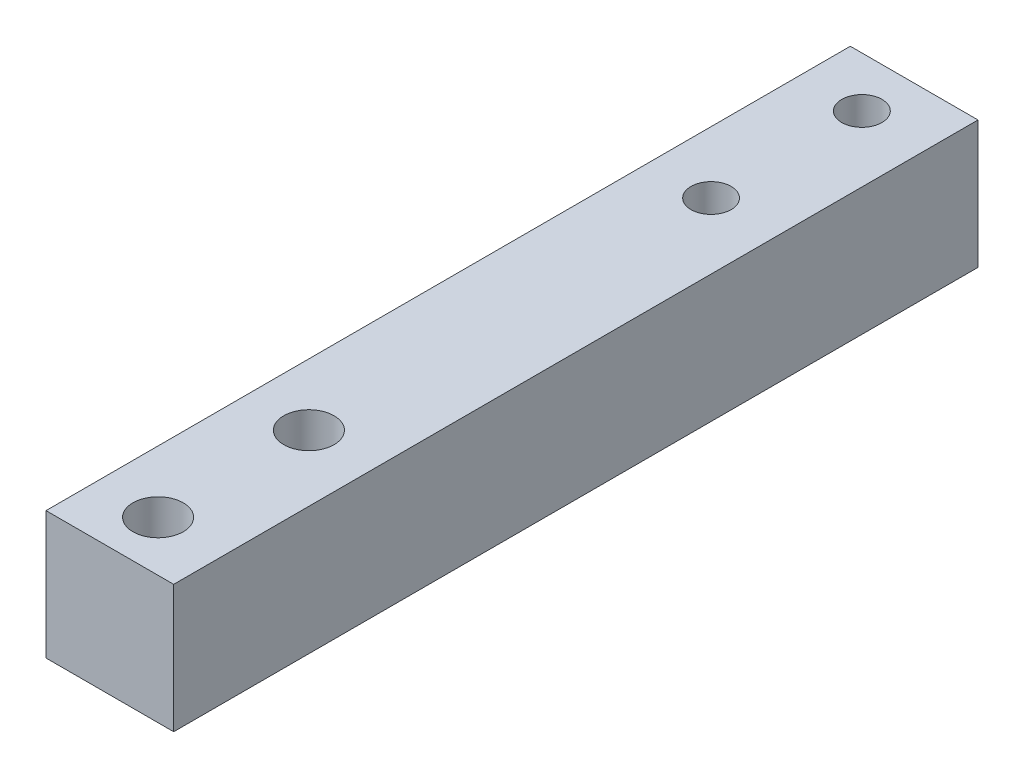
ISO-10303-21;
HEADER;
FILE_DESCRIPTION(('STEP AP214'),'2;1');
FILE_NAME('part.step','',(''),(''),'','','');
FILE_SCHEMA(('AUTOMOTIVE_DESIGN { 1 0 10303 214 1 1 1 1 }'));
ENDSEC;
DATA;
#1=APPLICATION_CONTEXT('core data for automotive mechanical design processes');
#2=APPLICATION_PROTOCOL_DEFINITION('international standard','automotive_design',2000,#1);
#3=PRODUCT_CONTEXT('',#1,'mechanical');
#4=PRODUCT('Part','Part','',(#3));
#5=PRODUCT_RELATED_PRODUCT_CATEGORY('part','',(#4));
#6=PRODUCT_DEFINITION_FORMATION('','',#4);
#7=PRODUCT_DEFINITION_CONTEXT('part definition',#1,'design');
#8=PRODUCT_DEFINITION('design','',#6,#7);
#9=PRODUCT_DEFINITION_SHAPE('','',#8);
#10=(LENGTH_UNIT() NAMED_UNIT(*) SI_UNIT(.MILLI.,.METRE.));
#11=(NAMED_UNIT(*) PLANE_ANGLE_UNIT() SI_UNIT($,.RADIAN.));
#12=(NAMED_UNIT(*) SI_UNIT($,.STERADIAN.) SOLID_ANGLE_UNIT());
#13=UNCERTAINTY_MEASURE_WITH_UNIT(LENGTH_MEASURE(1.E-05),#10,'distance_accuracy_value','');
#14=(GEOMETRIC_REPRESENTATION_CONTEXT(3) GLOBAL_UNCERTAINTY_ASSIGNED_CONTEXT((#13)) GLOBAL_UNIT_ASSIGNED_CONTEXT((#10,
#11,#12)) REPRESENTATION_CONTEXT('',''));
#15=CARTESIAN_POINT('',(0.,0.,0.));
#16=DIRECTION('',(0.,0.,1.));
#17=DIRECTION('',(1.,0.,0.));
#18=AXIS2_PLACEMENT_3D('',#15,#16,#17);
#19=CARTESIAN_POINT('',(-262.44218195293,-44.9739937166285,-48.1574778179379));
#20=DIRECTION('',(0.,0.,1.));
#21=DIRECTION('',(0.,-1.,0.));
#22=AXIS2_PLACEMENT_3D('',#19,#20,#21);
#23=PLANE('',#22);
#24=DIRECTION('',(1.,0.,0.));
#25=VECTOR('',#24,1.);
#26=CARTESIAN_POINT('',(-262.44218195293,-32.2739937166286,-48.1574778179379));
#27=LINE('',#26,#25);
#28=CARTESIAN_POINT('',(-275.14218195293,-32.2739937166286,-48.1574778179379));
#29=VERTEX_POINT('',#28);
#30=CARTESIAN_POINT('',(-262.44218195293,-32.2739937166286,-48.1574778179379));
#31=VERTEX_POINT('',#30);
#32=EDGE_CURVE('E119',#29,#31,#27,.T.);
#33=ORIENTED_EDGE('',*,*,#32,.F.);
#34=DIRECTION('',(0.,1.,0.));
#35=VECTOR('',#34,1.);
#36=CARTESIAN_POINT('',(-275.14218195293,-44.9739937166285,-48.1574778179379));
#37=LINE('',#36,#35);
#38=CARTESIAN_POINT('',(-275.14218195293,-44.9739937166285,-48.1574778179379));
#39=VERTEX_POINT('',#38);
#40=EDGE_CURVE('E11',#39,#29,#37,.T.);
#41=ORIENTED_EDGE('',*,*,#40,.F.);
#42=DIRECTION('',(1.,0.,0.));
#43=VECTOR('',#42,1.);
#44=CARTESIAN_POINT('',(-262.44218195293,-44.9739937166285,-48.1574778179379));
#45=LINE('',#44,#43);
#46=CARTESIAN_POINT('',(-262.44218195293,-44.9739937166285,-48.1574778179379));
#47=VERTEX_POINT('',#46);
#48=EDGE_CURVE('E109',#39,#47,#45,.T.);
#49=ORIENTED_EDGE('',*,*,#48,.T.);
#50=DIRECTION('',(0.,1.,0.));
#51=VECTOR('',#50,1.);
#52=CARTESIAN_POINT('',(-262.44218195293,-44.9739937166285,-48.1574778179379));
#53=LINE('',#52,#51);
#54=EDGE_CURVE('E44',#47,#31,#53,.T.);
#55=ORIENTED_EDGE('',*,*,#54,.T.);
#56=EDGE_LOOP('',(#33,#41,#49,#55));
#57=FACE_BOUND('',#56,.T.);
#58=ADVANCED_FACE('F41',(#57),#23,.T.);
#59=CARTESIAN_POINT('',(-275.14218195293,-44.9739937166285,-48.1574778179379));
#60=DIRECTION('',(-1.,0.,0.));
#61=DIRECTION('',(0.,-1.,0.));
#62=AXIS2_PLACEMENT_3D('',#59,#60,#61);
#63=PLANE('',#62);
#64=DIRECTION('',(0.,0.,1.));
#65=VECTOR('',#64,1.);
#66=CARTESIAN_POINT('',(-275.14218195293,-32.2739937166286,-48.1574778179379));
#67=LINE('',#66,#65);
#68=CARTESIAN_POINT('',(-275.14218195293,-32.2739937166286,-128.157477817938));
#69=VERTEX_POINT('',#68);
#70=EDGE_CURVE('E113',#69,#29,#67,.T.);
#71=ORIENTED_EDGE('',*,*,#70,.F.);
#72=DIRECTION('',(0.,1.,0.));
#73=VECTOR('',#72,1.);
#74=CARTESIAN_POINT('',(-275.14218195293,-44.9739937166286,-128.157477817938));
#75=LINE('',#74,#73);
#76=CARTESIAN_POINT('',(-275.14218195293,-44.9739937166286,-128.157477817938));
#77=VERTEX_POINT('',#76);
#78=EDGE_CURVE('E51',#77,#69,#75,.T.);
#79=ORIENTED_EDGE('',*,*,#78,.F.);
#80=DIRECTION('',(0.,0.,1.));
#81=VECTOR('',#80,1.);
#82=CARTESIAN_POINT('',(-275.14218195293,-44.9739937166285,-48.1574778179379));
#83=LINE('',#82,#81);
#84=EDGE_CURVE('E104',#77,#39,#83,.T.);
#85=ORIENTED_EDGE('',*,*,#84,.T.);
#86=ORIENTED_EDGE('',*,*,#40,.T.);
#87=EDGE_LOOP('',(#71,#79,#85,#86));
#88=FACE_BOUND('',#87,.T.);
#89=ADVANCED_FACE('F195',(#88),#63,.T.);
#90=CARTESIAN_POINT('',(-262.44218195293,-44.9739937166286,-128.157477817938));
#91=DIRECTION('',(0.,0.,-1.));
#92=DIRECTION('',(0.,1.,0.));
#93=AXIS2_PLACEMENT_3D('',#90,#91,#92);
#94=PLANE('',#93);
#95=DIRECTION('',(-1.,0.,0.));
#96=VECTOR('',#95,1.);
#97=CARTESIAN_POINT('',(-262.44218195293,-32.2739937166286,-128.157477817938));
#98=LINE('',#97,#96);
#99=CARTESIAN_POINT('',(-262.44218195293,-32.2739937166286,-128.157477817938));
#100=VERTEX_POINT('',#99);
#101=EDGE_CURVE('E98',#100,#69,#98,.T.);
#102=ORIENTED_EDGE('',*,*,#101,.F.);
#103=DIRECTION('',(0.,1.,0.));
#104=VECTOR('',#103,1.);
#105=CARTESIAN_POINT('',(-262.44218195293,-44.9739937166286,-128.157477817938));
#106=LINE('',#105,#104);
#107=CARTESIAN_POINT('',(-262.44218195293,-44.9739937166286,-128.157477817938));
#108=VERTEX_POINT('',#107);
#109=EDGE_CURVE('E93',#108,#100,#106,.T.);
#110=ORIENTED_EDGE('',*,*,#109,.F.);
#111=DIRECTION('',(-1.,0.,0.));
#112=VECTOR('',#111,1.);
#113=CARTESIAN_POINT('',(-262.44218195293,-44.9739937166286,-128.157477817938));
#114=LINE('',#113,#112);
#115=EDGE_CURVE('E96',#108,#77,#114,.T.);
#116=ORIENTED_EDGE('',*,*,#115,.T.);
#117=ORIENTED_EDGE('',*,*,#78,.T.);
#118=EDGE_LOOP('',(#102,#110,#116,#117));
#119=FACE_BOUND('',#118,.T.);
#120=ADVANCED_FACE('F95',(#119),#94,.T.);
#121=CARTESIAN_POINT('',(-262.44218195293,-44.9739937166285,-48.1574778179379));
#122=DIRECTION('',(1.,0.,0.));
#123=DIRECTION('',(0.,1.,0.));
#124=AXIS2_PLACEMENT_3D('',#121,#122,#123);
#125=PLANE('',#124);
#126=DIRECTION('',(0.,0.,-1.));
#127=VECTOR('',#126,1.);
#128=CARTESIAN_POINT('',(-262.44218195293,-32.2739937166286,-48.1574778179379));
#129=LINE('',#128,#127);
#130=EDGE_CURVE('E123',#31,#100,#129,.T.);
#131=ORIENTED_EDGE('',*,*,#130,.F.);
#132=ORIENTED_EDGE('',*,*,#54,.F.);
#133=DIRECTION('',(0.,0.,-1.));
#134=VECTOR('',#133,1.);
#135=CARTESIAN_POINT('',(-262.44218195293,-44.9739937166285,-48.1574778179379));
#136=LINE('',#135,#134);
#137=EDGE_CURVE('E103',#47,#108,#136,.T.);
#138=ORIENTED_EDGE('',*,*,#137,.T.);
#139=ORIENTED_EDGE('',*,*,#109,.T.);
#140=EDGE_LOOP('',(#131,#132,#138,#139));
#141=FACE_BOUND('',#140,.T.);
#142=ADVANCED_FACE('F107',(#141),#125,.T.);
#143=CARTESIAN_POINT('',(0.,-44.9739937166285,0.));
#144=DIRECTION('',(0.,-1.,0.));
#145=DIRECTION('',(0.,0.,-1.));
#146=AXIS2_PLACEMENT_3D('',#143,#144,#145);
#147=PLANE('',#146);
#148=CARTESIAN_POINT('',(-268.992578515679,-44.9739937166284,-68.1574778179379));
#149=DIRECTION('',(0.,-1.,0.));
#150=DIRECTION('',(1.,0.,0.));
#151=AXIS2_PLACEMENT_3D('',#148,#149,#150);
#152=CIRCLE('',#151,2.50000000000002);
#153=CARTESIAN_POINT('',(-266.492578515679,-44.9739937166284,-68.1574778179379));
#154=VERTEX_POINT('',#153);
#155=EDGE_CURVE('E156',#154,#154,#152,.T.);
#156=ORIENTED_EDGE('',*,*,#155,.F.);
#157=EDGE_LOOP('',(#156));
#158=FACE_BOUND('',#157,.T.);
#159=CARTESIAN_POINT('',(-268.992578515679,-44.9739937166284,-53.1574778179379));
#160=DIRECTION('',(0.,-1.,0.));
#161=DIRECTION('',(1.,0.,0.));
#162=AXIS2_PLACEMENT_3D('',#159,#160,#161);
#163=CIRCLE('',#162,2.50000000000002);
#164=CARTESIAN_POINT('',(-266.492578515679,-44.9739937166284,-53.1574778179379));
#165=VERTEX_POINT('',#164);
#166=EDGE_CURVE('E149',#165,#165,#163,.T.);
#167=ORIENTED_EDGE('',*,*,#166,.F.);
#168=EDGE_LOOP('',(#167));
#169=FACE_BOUND('',#168,.T.);
#170=CARTESIAN_POINT('',(-268.992578515679,-44.9739937166284,-108.157477817938));
#171=DIRECTION('',(0.,-1.,0.));
#172=DIRECTION('',(1.,0.,0.));
#173=AXIS2_PLACEMENT_3D('',#170,#171,#172);
#174=CIRCLE('',#173,2.);
#175=CARTESIAN_POINT('',(-266.992578515679,-44.9739937166284,-108.157477817938));
#176=VERTEX_POINT('',#175);
#177=EDGE_CURVE('E143',#176,#176,#174,.T.);
#178=ORIENTED_EDGE('',*,*,#177,.F.);
#179=EDGE_LOOP('',(#178));
#180=FACE_BOUND('',#179,.T.);
#181=CARTESIAN_POINT('',(-268.992578515679,-44.9739937166284,-123.157477817938));
#182=DIRECTION('',(0.,-1.,0.));
#183=DIRECTION('',(1.,0.,0.));
#184=AXIS2_PLACEMENT_3D('',#181,#182,#183);
#185=CIRCLE('',#184,2.);
#186=CARTESIAN_POINT('',(-266.992578515679,-44.9739937166284,-123.157477817938));
#187=VERTEX_POINT('',#186);
#188=EDGE_CURVE('E133',#187,#187,#185,.T.);
#189=ORIENTED_EDGE('',*,*,#188,.F.);
#190=EDGE_LOOP('',(#189));
#191=FACE_BOUND('',#190,.T.);
#192=ORIENTED_EDGE('',*,*,#48,.F.);
#193=ORIENTED_EDGE('',*,*,#84,.F.);
#194=ORIENTED_EDGE('',*,*,#115,.F.);
#195=ORIENTED_EDGE('',*,*,#137,.F.);
#196=EDGE_LOOP('',(#192,#193,#194,#195));
#197=FACE_BOUND('',#196,.T.);
#198=ADVANCED_FACE('F102',(#158,#169,#180,#191,#197),#147,.T.);
#199=CARTESIAN_POINT('',(0.,-32.2739937166285,0.));
#200=DIRECTION('',(0.,-1.,0.));
#201=DIRECTION('',(0.,0.,-1.));
#202=AXIS2_PLACEMENT_3D('',#199,#200,#201);
#203=PLANE('',#202);
#204=CARTESIAN_POINT('',(-268.992578515679,-32.2739937166284,-68.1574778179379));
#205=DIRECTION('',(0.,-1.,0.));
#206=DIRECTION('',(1.,0.,0.));
#207=AXIS2_PLACEMENT_3D('',#204,#205,#206);
#208=CIRCLE('',#207,2.50000000000002);
#209=CARTESIAN_POINT('',(-266.492578515679,-32.2739937166284,-68.1574778179379));
#210=VERTEX_POINT('',#209);
#211=EDGE_CURVE('E153',#210,#210,#208,.T.);
#212=ORIENTED_EDGE('',*,*,#211,.T.);
#213=EDGE_LOOP('',(#212));
#214=FACE_BOUND('',#213,.T.);
#215=CARTESIAN_POINT('',(-268.992578515679,-32.2739937166284,-53.1574778179379));
#216=DIRECTION('',(0.,-1.,0.));
#217=DIRECTION('',(1.,0.,0.));
#218=AXIS2_PLACEMENT_3D('',#215,#216,#217);
#219=CIRCLE('',#218,2.50000000000002);
#220=CARTESIAN_POINT('',(-266.492578515679,-32.2739937166284,-53.1574778179379));
#221=VERTEX_POINT('',#220);
#222=EDGE_CURVE('E147',#221,#221,#219,.T.);
#223=ORIENTED_EDGE('',*,*,#222,.T.);
#224=EDGE_LOOP('',(#223));
#225=FACE_BOUND('',#224,.T.);
#226=CARTESIAN_POINT('',(-268.992578515679,-32.2739937166284,-108.157477817938));
#227=DIRECTION('',(0.,-1.,0.));
#228=DIRECTION('',(1.,0.,0.));
#229=AXIS2_PLACEMENT_3D('',#226,#227,#228);
#230=CIRCLE('',#229,2.);
#231=CARTESIAN_POINT('',(-266.992578515679,-32.2739937166284,-108.157477817938));
#232=VERTEX_POINT('',#231);
#233=EDGE_CURVE('E135',#232,#232,#230,.T.);
#234=ORIENTED_EDGE('',*,*,#233,.T.);
#235=EDGE_LOOP('',(#234));
#236=FACE_BOUND('',#235,.T.);
#237=CARTESIAN_POINT('',(-268.992578515679,-32.2739937166284,-123.157477817938));
#238=DIRECTION('',(0.,-1.,0.));
#239=DIRECTION('',(1.,0.,0.));
#240=AXIS2_PLACEMENT_3D('',#237,#238,#239);
#241=CIRCLE('',#240,2.);
#242=CARTESIAN_POINT('',(-266.992578515679,-32.2739937166284,-123.157477817938));
#243=VERTEX_POINT('',#242);
#244=EDGE_CURVE('E124',#243,#243,#241,.T.);
#245=ORIENTED_EDGE('',*,*,#244,.T.);
#246=EDGE_LOOP('',(#245));
#247=FACE_BOUND('',#246,.T.);
#248=ORIENTED_EDGE('',*,*,#32,.T.);
#249=ORIENTED_EDGE('',*,*,#130,.T.);
#250=ORIENTED_EDGE('',*,*,#101,.T.);
#251=ORIENTED_EDGE('',*,*,#70,.T.);
#252=EDGE_LOOP('',(#248,#249,#250,#251));
#253=FACE_BOUND('',#252,.T.);
#254=ADVANCED_FACE('F162',(#214,#225,#236,#247,#253),#203,.F.);
#255=CARTESIAN_POINT('',(-268.992578515679,-32.2739937166284,-123.157477817938));
#256=DIRECTION('',(0.,-1.,0.));
#257=DIRECTION('',(1.,0.,0.));
#258=AXIS2_PLACEMENT_3D('',#255,#256,#257);
#259=CYLINDRICAL_SURFACE('',#258,2.);
#260=ORIENTED_EDGE('',*,*,#244,.F.);
#261=EDGE_LOOP('',(#260));
#262=FACE_BOUND('',#261,.T.);
#263=ORIENTED_EDGE('',*,*,#188,.T.);
#264=EDGE_LOOP('',(#263));
#265=FACE_BOUND('',#264,.T.);
#266=ADVANCED_FACE('F182',(#262,#265),#259,.F.);
#267=CARTESIAN_POINT('',(-268.992578515679,-32.2739937166284,-108.157477817938));
#268=DIRECTION('',(0.,-1.,0.));
#269=DIRECTION('',(1.,0.,0.));
#270=AXIS2_PLACEMENT_3D('',#267,#268,#269);
#271=CYLINDRICAL_SURFACE('',#270,2.);
#272=ORIENTED_EDGE('',*,*,#233,.F.);
#273=EDGE_LOOP('',(#272));
#274=FACE_BOUND('',#273,.T.);
#275=ORIENTED_EDGE('',*,*,#177,.T.);
#276=EDGE_LOOP('',(#275));
#277=FACE_BOUND('',#276,.T.);
#278=ADVANCED_FACE('F180',(#274,#277),#271,.F.);
#279=CARTESIAN_POINT('',(-268.992578515679,-32.2739937166284,-53.1574778179379));
#280=DIRECTION('',(0.,-1.,0.));
#281=DIRECTION('',(1.,0.,0.));
#282=AXIS2_PLACEMENT_3D('',#279,#280,#281);
#283=CYLINDRICAL_SURFACE('',#282,2.50000000000002);
#284=ORIENTED_EDGE('',*,*,#222,.F.);
#285=EDGE_LOOP('',(#284));
#286=FACE_BOUND('',#285,.T.);
#287=ORIENTED_EDGE('',*,*,#166,.T.);
#288=EDGE_LOOP('',(#287));
#289=FACE_BOUND('',#288,.T.);
#290=ADVANCED_FACE('F168',(#286,#289),#283,.F.);
#291=CARTESIAN_POINT('',(-268.992578515679,-32.2739937166284,-68.1574778179379));
#292=DIRECTION('',(0.,-1.,0.));
#293=DIRECTION('',(1.,0.,0.));
#294=AXIS2_PLACEMENT_3D('',#291,#292,#293);
#295=CYLINDRICAL_SURFACE('',#294,2.50000000000002);
#296=ORIENTED_EDGE('',*,*,#211,.F.);
#297=EDGE_LOOP('',(#296));
#298=FACE_BOUND('',#297,.T.);
#299=ORIENTED_EDGE('',*,*,#155,.T.);
#300=EDGE_LOOP('',(#299));
#301=FACE_BOUND('',#300,.T.);
#302=ADVANCED_FACE('F165',(#298,#301),#295,.F.);
#303=CLOSED_SHELL('',(#58,#89,#120,#142,#198,#254,#266,#278,#290,#302));
#304=MANIFOLD_SOLID_BREP('B2',#303);
#305=ADVANCED_BREP_SHAPE_REPRESENTATION('',(#18,#304),#14);
#306=SHAPE_DEFINITION_REPRESENTATION(#9,#305);
ENDSEC;
END-ISO-10303-21;
